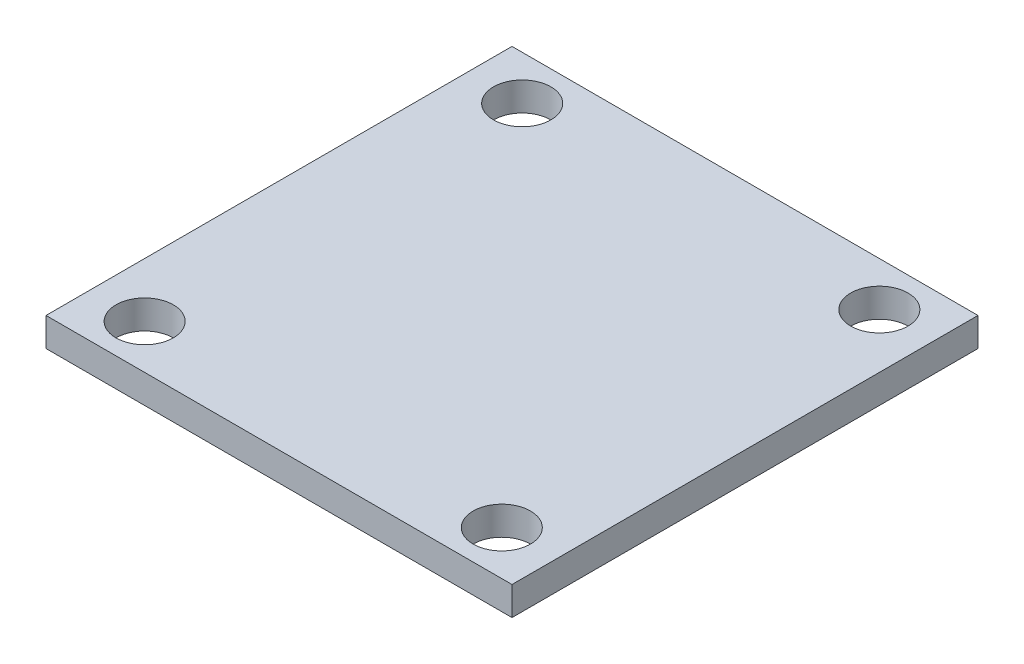
ISO-10303-21;
HEADER;
FILE_DESCRIPTION(('STEP AP214'),'2;1');
FILE_NAME('part.step','',(''),(''),'','','');
FILE_SCHEMA(('AUTOMOTIVE_DESIGN { 1 0 10303 214 1 1 1 1 }'));
ENDSEC;
DATA;
#1=APPLICATION_CONTEXT('core data for automotive mechanical design processes');
#2=APPLICATION_PROTOCOL_DEFINITION('international standard','automotive_design',2000,#1);
#3=PRODUCT_CONTEXT('',#1,'mechanical');
#4=PRODUCT('Part','Part','',(#3));
#5=PRODUCT_RELATED_PRODUCT_CATEGORY('part','',(#4));
#6=PRODUCT_DEFINITION_FORMATION('','',#4);
#7=PRODUCT_DEFINITION_CONTEXT('part definition',#1,'design');
#8=PRODUCT_DEFINITION('design','',#6,#7);
#9=PRODUCT_DEFINITION_SHAPE('','',#8);
#10=(LENGTH_UNIT() NAMED_UNIT(*) SI_UNIT(.MILLI.,.METRE.));
#11=(NAMED_UNIT(*) PLANE_ANGLE_UNIT() SI_UNIT($,.RADIAN.));
#12=(NAMED_UNIT(*) SI_UNIT($,.STERADIAN.) SOLID_ANGLE_UNIT());
#13=UNCERTAINTY_MEASURE_WITH_UNIT(LENGTH_MEASURE(1.E-05),#10,'distance_accuracy_value','');
#14=(GEOMETRIC_REPRESENTATION_CONTEXT(3) GLOBAL_UNCERTAINTY_ASSIGNED_CONTEXT((#13)) GLOBAL_UNIT_ASSIGNED_CONTEXT((#10,
#11,#12)) REPRESENTATION_CONTEXT('',''));
#15=CARTESIAN_POINT('',(0.,0.,0.));
#16=DIRECTION('',(0.,0.,1.));
#17=DIRECTION('',(1.,0.,0.));
#18=AXIS2_PLACEMENT_3D('',#15,#16,#17);
#19=CARTESIAN_POINT('',(-13.,1.6,13.));
#20=DIRECTION('',(1.,0.,0.));
#21=DIRECTION('',(0.,0.,-1.));
#22=AXIS2_PLACEMENT_3D('',#19,#20,#21);
#23=PLANE('',#22);
#24=DIRECTION('',(0.,0.,1.));
#25=VECTOR('',#24,1.);
#26=CARTESIAN_POINT('',(-13.,0.,13.));
#27=LINE('',#26,#25);
#28=CARTESIAN_POINT('',(-13.,0.,-13.));
#29=VERTEX_POINT('',#28);
#30=CARTESIAN_POINT('',(-13.,0.,13.));
#31=VERTEX_POINT('',#30);
#32=EDGE_CURVE('E96',#29,#31,#27,.T.);
#33=ORIENTED_EDGE('',*,*,#32,.T.);
#34=DIRECTION('',(0.,-1.,0.));
#35=VECTOR('',#34,1.);
#36=CARTESIAN_POINT('',(-13.,1.6,13.));
#37=LINE('',#36,#35);
#38=CARTESIAN_POINT('',(-13.,1.6,13.));
#39=VERTEX_POINT('',#38);
#40=EDGE_CURVE('E11',#39,#31,#37,.T.);
#41=ORIENTED_EDGE('',*,*,#40,.F.);
#42=DIRECTION('',(0.,0.,1.));
#43=VECTOR('',#42,1.);
#44=CARTESIAN_POINT('',(-13.,1.6,13.));
#45=LINE('',#44,#43);
#46=CARTESIAN_POINT('',(-13.,1.6,-13.));
#47=VERTEX_POINT('',#46);
#48=EDGE_CURVE('E84',#47,#39,#45,.T.);
#49=ORIENTED_EDGE('',*,*,#48,.F.);
#50=DIRECTION('',(0.,-1.,0.));
#51=VECTOR('',#50,1.);
#52=CARTESIAN_POINT('',(-13.,1.6,-13.));
#53=LINE('',#52,#51);
#54=EDGE_CURVE('E92',#47,#29,#53,.T.);
#55=ORIENTED_EDGE('',*,*,#54,.T.);
#56=EDGE_LOOP('',(#33,#41,#49,#55));
#57=FACE_BOUND('',#56,.T.);
#58=ADVANCED_FACE('F33',(#57),#23,.F.);
#59=CARTESIAN_POINT('',(13.,1.6,13.));
#60=DIRECTION('',(0.,0.,-1.));
#61=DIRECTION('',(-1.,0.,0.));
#62=AXIS2_PLACEMENT_3D('',#59,#60,#61);
#63=PLANE('',#62);
#64=DIRECTION('',(1.,0.,0.));
#65=VECTOR('',#64,1.);
#66=CARTESIAN_POINT('',(13.,0.,13.));
#67=LINE('',#66,#65);
#68=CARTESIAN_POINT('',(13.,0.,13.));
#69=VERTEX_POINT('',#68);
#70=EDGE_CURVE('E88',#31,#69,#67,.T.);
#71=ORIENTED_EDGE('',*,*,#70,.T.);
#72=DIRECTION('',(0.,-1.,0.));
#73=VECTOR('',#72,1.);
#74=CARTESIAN_POINT('',(13.,1.6,13.));
#75=LINE('',#74,#73);
#76=CARTESIAN_POINT('',(13.,1.6,13.));
#77=VERTEX_POINT('',#76);
#78=EDGE_CURVE('E41',#77,#69,#75,.T.);
#79=ORIENTED_EDGE('',*,*,#78,.F.);
#80=DIRECTION('',(1.,0.,0.));
#81=VECTOR('',#80,1.);
#82=CARTESIAN_POINT('',(13.,1.6,13.));
#83=LINE('',#82,#81);
#84=EDGE_CURVE('E79',#39,#77,#83,.T.);
#85=ORIENTED_EDGE('',*,*,#84,.F.);
#86=ORIENTED_EDGE('',*,*,#40,.T.);
#87=EDGE_LOOP('',(#71,#79,#85,#86));
#88=FACE_BOUND('',#87,.T.);
#89=ADVANCED_FACE('F87',(#88),#63,.F.);
#90=CARTESIAN_POINT('',(13.,1.6,13.));
#91=DIRECTION('',(-1.,0.,0.));
#92=DIRECTION('',(0.,0.,1.));
#93=AXIS2_PLACEMENT_3D('',#90,#91,#92);
#94=PLANE('',#93);
#95=DIRECTION('',(0.,0.,-1.));
#96=VECTOR('',#95,1.);
#97=CARTESIAN_POINT('',(13.,0.,13.));
#98=LINE('',#97,#96);
#99=CARTESIAN_POINT('',(13.,0.,-13.));
#100=VERTEX_POINT('',#99);
#101=EDGE_CURVE('E66',#69,#100,#98,.T.);
#102=ORIENTED_EDGE('',*,*,#101,.T.);
#103=DIRECTION('',(0.,-1.,0.));
#104=VECTOR('',#103,1.);
#105=CARTESIAN_POINT('',(13.,1.6,-13.));
#106=LINE('',#105,#104);
#107=CARTESIAN_POINT('',(13.,1.6,-13.));
#108=VERTEX_POINT('',#107);
#109=EDGE_CURVE('E89',#108,#100,#106,.T.);
#110=ORIENTED_EDGE('',*,*,#109,.F.);
#111=DIRECTION('',(0.,0.,-1.));
#112=VECTOR('',#111,1.);
#113=CARTESIAN_POINT('',(13.,1.6,13.));
#114=LINE('',#113,#112);
#115=EDGE_CURVE('E82',#77,#108,#114,.T.);
#116=ORIENTED_EDGE('',*,*,#115,.F.);
#117=ORIENTED_EDGE('',*,*,#78,.T.);
#118=EDGE_LOOP('',(#102,#110,#116,#117));
#119=FACE_BOUND('',#118,.T.);
#120=ADVANCED_FACE('F90',(#119),#94,.F.);
#121=CARTESIAN_POINT('',(13.,1.6,-13.));
#122=DIRECTION('',(0.,0.,1.));
#123=DIRECTION('',(1.,0.,0.));
#124=AXIS2_PLACEMENT_3D('',#121,#122,#123);
#125=PLANE('',#124);
#126=DIRECTION('',(-1.,0.,0.));
#127=VECTOR('',#126,1.);
#128=CARTESIAN_POINT('',(13.,0.,-13.));
#129=LINE('',#128,#127);
#130=EDGE_CURVE('E72',#100,#29,#129,.T.);
#131=ORIENTED_EDGE('',*,*,#130,.T.);
#132=ORIENTED_EDGE('',*,*,#54,.F.);
#133=DIRECTION('',(-1.,0.,0.));
#134=VECTOR('',#133,1.);
#135=CARTESIAN_POINT('',(13.,1.6,-13.));
#136=LINE('',#135,#134);
#137=EDGE_CURVE('E49',#108,#47,#136,.T.);
#138=ORIENTED_EDGE('',*,*,#137,.F.);
#139=ORIENTED_EDGE('',*,*,#109,.T.);
#140=EDGE_LOOP('',(#131,#132,#138,#139));
#141=FACE_BOUND('',#140,.T.);
#142=ADVANCED_FACE('F104',(#141),#125,.F.);
#143=CARTESIAN_POINT('',(0.,1.6,0.));
#144=DIRECTION('',(0.,1.,0.));
#145=DIRECTION('',(0.,0.,1.));
#146=AXIS2_PLACEMENT_3D('',#143,#144,#145);
#147=PLANE('',#146);
#148=CARTESIAN_POINT('',(-9.96377260458079,1.6,10.5328242727303));
#149=DIRECTION('',(0.,1.,0.));
#150=DIRECTION('',(0.,0.,1.));
#151=AXIS2_PLACEMENT_3D('',#148,#149,#150);
#152=CIRCLE('',#151,1.6);
#153=CARTESIAN_POINT('',(-9.96377260458079,1.6,12.1328242727303));
#154=VERTEX_POINT('',#153);
#155=EDGE_CURVE('E123',#154,#154,#152,.T.);
#156=ORIENTED_EDGE('',*,*,#155,.F.);
#157=EDGE_LOOP('',(#156));
#158=FACE_BOUND('',#157,.T.);
#159=CARTESIAN_POINT('',(9.96377260458079,1.6,-10.5328242727303));
#160=DIRECTION('',(0.,1.,0.));
#161=DIRECTION('',(0.,0.,1.));
#162=AXIS2_PLACEMENT_3D('',#159,#160,#161);
#163=CIRCLE('',#162,1.6);
#164=CARTESIAN_POINT('',(9.96377260458079,1.6,-8.93282427273034));
#165=VERTEX_POINT('',#164);
#166=EDGE_CURVE('E116',#165,#165,#163,.T.);
#167=ORIENTED_EDGE('',*,*,#166,.F.);
#168=EDGE_LOOP('',(#167));
#169=FACE_BOUND('',#168,.T.);
#170=CARTESIAN_POINT('',(9.96377260458079,1.6,10.5328242727303));
#171=DIRECTION('',(0.,1.,0.));
#172=DIRECTION('',(0.,0.,1.));
#173=AXIS2_PLACEMENT_3D('',#170,#171,#172);
#174=CIRCLE('',#173,1.6);
#175=CARTESIAN_POINT('',(9.96377260458079,1.6,12.1328242727303));
#176=VERTEX_POINT('',#175);
#177=EDGE_CURVE('E128',#176,#176,#174,.T.);
#178=ORIENTED_EDGE('',*,*,#177,.F.);
#179=EDGE_LOOP('',(#178));
#180=FACE_BOUND('',#179,.T.);
#181=CARTESIAN_POINT('',(-9.96377260458079,1.6,-10.5328242727303));
#182=DIRECTION('',(0.,1.,0.));
#183=DIRECTION('',(0.,0.,1.));
#184=AXIS2_PLACEMENT_3D('',#181,#182,#183);
#185=CIRCLE('',#184,1.6);
#186=CARTESIAN_POINT('',(-9.96377260458079,1.6,-8.93282427273034));
#187=VERTEX_POINT('',#186);
#188=EDGE_CURVE('E110',#187,#187,#185,.T.);
#189=ORIENTED_EDGE('',*,*,#188,.F.);
#190=EDGE_LOOP('',(#189));
#191=FACE_BOUND('',#190,.T.);
#192=ORIENTED_EDGE('',*,*,#48,.T.);
#193=ORIENTED_EDGE('',*,*,#84,.T.);
#194=ORIENTED_EDGE('',*,*,#115,.T.);
#195=ORIENTED_EDGE('',*,*,#137,.T.);
#196=EDGE_LOOP('',(#192,#193,#194,#195));
#197=FACE_BOUND('',#196,.T.);
#198=ADVANCED_FACE('F80',(#158,#169,#180,#191,#197),#147,.T.);
#199=CARTESIAN_POINT('',(0.,0.,0.));
#200=DIRECTION('',(0.,1.,0.));
#201=DIRECTION('',(0.,0.,1.));
#202=AXIS2_PLACEMENT_3D('',#199,#200,#201);
#203=PLANE('',#202);
#204=CARTESIAN_POINT('',(-9.96377260458079,0.,10.5328242727303));
#205=DIRECTION('',(0.,1.,0.));
#206=DIRECTION('',(0.,0.,1.));
#207=AXIS2_PLACEMENT_3D('',#204,#205,#206);
#208=CIRCLE('',#207,1.6);
#209=CARTESIAN_POINT('',(-9.96377260458079,0.,12.1328242727303));
#210=VERTEX_POINT('',#209);
#211=EDGE_CURVE('E113',#210,#210,#208,.T.);
#212=ORIENTED_EDGE('',*,*,#211,.T.);
#213=EDGE_LOOP('',(#212));
#214=FACE_BOUND('',#213,.T.);
#215=CARTESIAN_POINT('',(9.96377260458079,0.,-10.5328242727303));
#216=DIRECTION('',(0.,1.,0.));
#217=DIRECTION('',(0.,0.,1.));
#218=AXIS2_PLACEMENT_3D('',#215,#216,#217);
#219=CIRCLE('',#218,1.6);
#220=CARTESIAN_POINT('',(9.96377260458079,0.,-8.93282427273034));
#221=VERTEX_POINT('',#220);
#222=EDGE_CURVE('E119',#221,#221,#219,.T.);
#223=ORIENTED_EDGE('',*,*,#222,.T.);
#224=EDGE_LOOP('',(#223));
#225=FACE_BOUND('',#224,.T.);
#226=CARTESIAN_POINT('',(9.96377260458079,0.,10.5328242727303));
#227=DIRECTION('',(0.,1.,0.));
#228=DIRECTION('',(0.,0.,1.));
#229=AXIS2_PLACEMENT_3D('',#226,#227,#228);
#230=CIRCLE('',#229,1.6);
#231=CARTESIAN_POINT('',(9.96377260458079,0.,12.1328242727303));
#232=VERTEX_POINT('',#231);
#233=EDGE_CURVE('E120',#232,#232,#230,.T.);
#234=ORIENTED_EDGE('',*,*,#233,.T.);
#235=EDGE_LOOP('',(#234));
#236=FACE_BOUND('',#235,.T.);
#237=CARTESIAN_POINT('',(-9.96377260458079,0.,-10.5328242727303));
#238=DIRECTION('',(0.,1.,0.));
#239=DIRECTION('',(0.,0.,1.));
#240=AXIS2_PLACEMENT_3D('',#237,#238,#239);
#241=CIRCLE('',#240,1.6);
#242=CARTESIAN_POINT('',(-9.96377260458079,0.,-8.93282427273034));
#243=VERTEX_POINT('',#242);
#244=EDGE_CURVE('E99',#243,#243,#241,.T.);
#245=ORIENTED_EDGE('',*,*,#244,.T.);
#246=EDGE_LOOP('',(#245));
#247=FACE_BOUND('',#246,.T.);
#248=ORIENTED_EDGE('',*,*,#32,.F.);
#249=ORIENTED_EDGE('',*,*,#130,.F.);
#250=ORIENTED_EDGE('',*,*,#101,.F.);
#251=ORIENTED_EDGE('',*,*,#70,.F.);
#252=EDGE_LOOP('',(#248,#249,#250,#251));
#253=FACE_BOUND('',#252,.T.);
#254=ADVANCED_FACE('F107',(#214,#225,#236,#247,#253),#203,.F.);
#255=CARTESIAN_POINT('',(-9.96377260458079,0.,-10.5328242727303));
#256=DIRECTION('',(0.,1.,0.));
#257=DIRECTION('',(0.,0.,1.));
#258=AXIS2_PLACEMENT_3D('',#255,#256,#257);
#259=CYLINDRICAL_SURFACE('',#258,1.6);
#260=ORIENTED_EDGE('',*,*,#244,.F.);
#261=EDGE_LOOP('',(#260));
#262=FACE_BOUND('',#261,.T.);
#263=ORIENTED_EDGE('',*,*,#188,.T.);
#264=EDGE_LOOP('',(#263));
#265=FACE_BOUND('',#264,.T.);
#266=ADVANCED_FACE('F140',(#262,#265),#259,.F.);
#267=CARTESIAN_POINT('',(9.96377260458079,0.,10.5328242727303));
#268=DIRECTION('',(0.,1.,0.));
#269=DIRECTION('',(0.,0.,1.));
#270=AXIS2_PLACEMENT_3D('',#267,#268,#269);
#271=CYLINDRICAL_SURFACE('',#270,1.6);
#272=ORIENTED_EDGE('',*,*,#233,.F.);
#273=EDGE_LOOP('',(#272));
#274=FACE_BOUND('',#273,.T.);
#275=ORIENTED_EDGE('',*,*,#177,.T.);
#276=EDGE_LOOP('',(#275));
#277=FACE_BOUND('',#276,.T.);
#278=ADVANCED_FACE('F136',(#274,#277),#271,.F.);
#279=CARTESIAN_POINT('',(9.96377260458079,0.,-10.5328242727303));
#280=DIRECTION('',(0.,1.,0.));
#281=DIRECTION('',(0.,0.,1.));
#282=AXIS2_PLACEMENT_3D('',#279,#280,#281);
#283=CYLINDRICAL_SURFACE('',#282,1.6);
#284=ORIENTED_EDGE('',*,*,#222,.F.);
#285=EDGE_LOOP('',(#284));
#286=FACE_BOUND('',#285,.T.);
#287=ORIENTED_EDGE('',*,*,#166,.T.);
#288=EDGE_LOOP('',(#287));
#289=FACE_BOUND('',#288,.T.);
#290=ADVANCED_FACE('F139',(#286,#289),#283,.F.);
#291=CARTESIAN_POINT('',(-9.96377260458079,0.,10.5328242727303));
#292=DIRECTION('',(0.,1.,0.));
#293=DIRECTION('',(0.,0.,1.));
#294=AXIS2_PLACEMENT_3D('',#291,#292,#293);
#295=CYLINDRICAL_SURFACE('',#294,1.6);
#296=ORIENTED_EDGE('',*,*,#211,.F.);
#297=EDGE_LOOP('',(#296));
#298=FACE_BOUND('',#297,.T.);
#299=ORIENTED_EDGE('',*,*,#155,.T.);
#300=EDGE_LOOP('',(#299));
#301=FACE_BOUND('',#300,.T.);
#302=ADVANCED_FACE('F201',(#298,#301),#295,.F.);
#303=CLOSED_SHELL('',(#58,#89,#120,#142,#198,#254,#266,#278,#290,#302));
#304=MANIFOLD_SOLID_BREP('B2',#303);
#305=ADVANCED_BREP_SHAPE_REPRESENTATION('',(#18,#304),#14);
#306=SHAPE_DEFINITION_REPRESENTATION(#9,#305);
ENDSEC;
END-ISO-10303-21;
